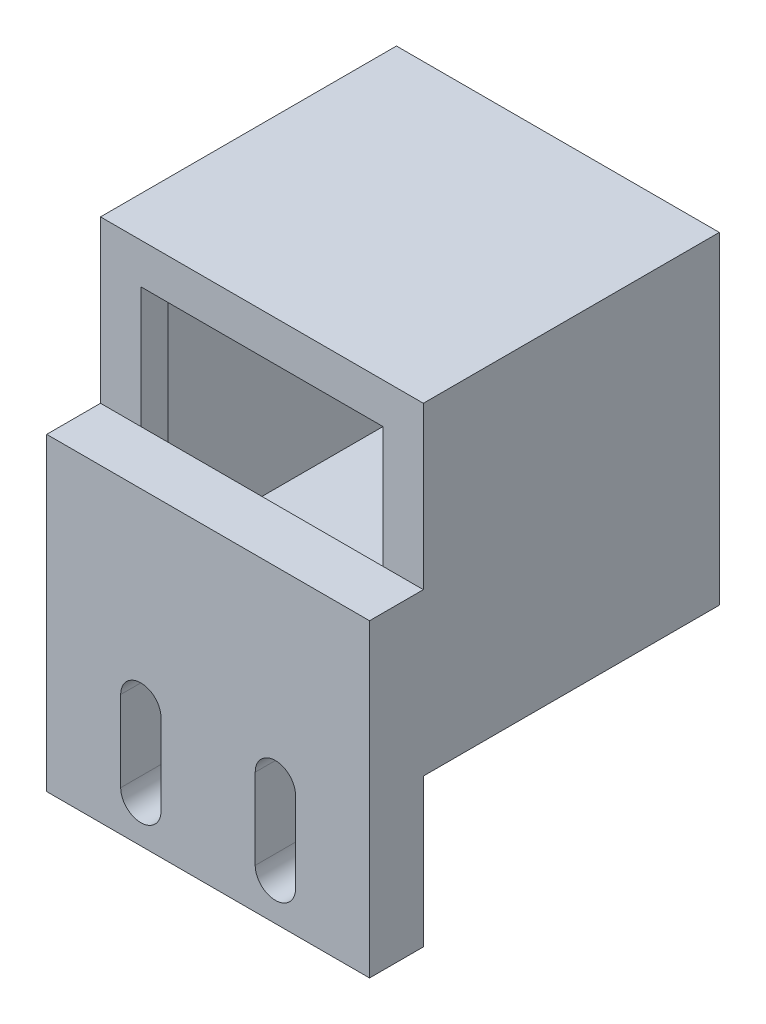
ISO-10303-21;
HEADER;
FILE_DESCRIPTION(('STEP AP214'),'2;1');
FILE_NAME('part.step','',(''),(''),'','','');
FILE_SCHEMA(('AUTOMOTIVE_DESIGN { 1 0 10303 214 1 1 1 1 }'));
ENDSEC;
DATA;
#1=APPLICATION_CONTEXT('core data for automotive mechanical design processes');
#2=APPLICATION_PROTOCOL_DEFINITION('international standard','automotive_design',2000,#1);
#3=PRODUCT_CONTEXT('',#1,'mechanical');
#4=PRODUCT('Part','Part','',(#3));
#5=PRODUCT_RELATED_PRODUCT_CATEGORY('part','',(#4));
#6=PRODUCT_DEFINITION_FORMATION('','',#4);
#7=PRODUCT_DEFINITION_CONTEXT('part definition',#1,'design');
#8=PRODUCT_DEFINITION('design','',#6,#7);
#9=PRODUCT_DEFINITION_SHAPE('','',#8);
#10=(LENGTH_UNIT() NAMED_UNIT(*) SI_UNIT(.MILLI.,.METRE.));
#11=(NAMED_UNIT(*) PLANE_ANGLE_UNIT() SI_UNIT($,.RADIAN.));
#12=(NAMED_UNIT(*) SI_UNIT($,.STERADIAN.) SOLID_ANGLE_UNIT());
#13=UNCERTAINTY_MEASURE_WITH_UNIT(LENGTH_MEASURE(1.E-05),#10,'distance_accuracy_value','');
#14=(GEOMETRIC_REPRESENTATION_CONTEXT(3) GLOBAL_UNCERTAINTY_ASSIGNED_CONTEXT((#13)) GLOBAL_UNIT_ASSIGNED_CONTEXT((#10,
#11,#12)) REPRESENTATION_CONTEXT('',''));
#15=CARTESIAN_POINT('',(0.,0.,0.));
#16=DIRECTION('',(0.,0.,1.));
#17=DIRECTION('',(1.,0.,0.));
#18=AXIS2_PLACEMENT_3D('',#15,#16,#17);
#19=CARTESIAN_POINT('',(-12.,9.,22.));
#20=DIRECTION('',(0.,1.,0.));
#21=DIRECTION('',(0.,0.,1.));
#22=AXIS2_PLACEMENT_3D('',#19,#20,#21);
#23=PLANE('',#22);
#24=DIRECTION('',(0.,0.,-1.));
#25=VECTOR('',#24,1.);
#26=CARTESIAN_POINT('',(9.,9.,22.));
#27=LINE('',#26,#25);
#28=CARTESIAN_POINT('',(9.,9.,22.));
#29=VERTEX_POINT('',#28);
#30=CARTESIAN_POINT('',(9.,9.,20.));
#31=VERTEX_POINT('',#30);
#32=EDGE_CURVE('E315',#29,#31,#27,.T.);
#33=ORIENTED_EDGE('',*,*,#32,.F.);
#34=DIRECTION('',(1.,0.,0.));
#35=VECTOR('',#34,1.);
#36=CARTESIAN_POINT('',(-12.,9.,22.));
#37=LINE('',#36,#35);
#38=CARTESIAN_POINT('',(-9.,9.,22.));
#39=VERTEX_POINT('',#38);
#40=EDGE_CURVE('E341',#39,#29,#37,.T.);
#41=ORIENTED_EDGE('',*,*,#40,.F.);
#42=DIRECTION('',(0.,0.,-1.));
#43=VECTOR('',#42,1.);
#44=CARTESIAN_POINT('',(-9.,9.,22.));
#45=LINE('',#44,#43);
#46=CARTESIAN_POINT('',(-9.,9.,20.));
#47=VERTEX_POINT('',#46);
#48=EDGE_CURVE('E334',#39,#47,#45,.T.);
#49=ORIENTED_EDGE('',*,*,#48,.T.);
#50=DIRECTION('',(1.,0.,0.));
#51=VECTOR('',#50,1.);
#52=CARTESIAN_POINT('',(-12.,9.,20.));
#53=LINE('',#52,#51);
#54=EDGE_CURVE('E338',#47,#31,#53,.T.);
#55=ORIENTED_EDGE('',*,*,#54,.T.);
#56=EDGE_LOOP('',(#33,#41,#49,#55));
#57=FACE_BOUND('',#56,.T.);
#58=ADVANCED_FACE('F36',(#57),#23,.F.);
#59=CARTESIAN_POINT('',(-9.,-9.,22.));
#60=DIRECTION('',(0.,-1.,0.));
#61=DIRECTION('',(0.,0.,-1.));
#62=AXIS2_PLACEMENT_3D('',#59,#60,#61);
#63=PLANE('',#62);
#64=DIRECTION('',(0.,0.,-1.));
#65=VECTOR('',#64,1.);
#66=CARTESIAN_POINT('',(9.00000000000001,-9.,22.));
#67=LINE('',#66,#65);
#68=CARTESIAN_POINT('',(9.00000000000001,-9.,22.));
#69=VERTEX_POINT('',#68);
#70=CARTESIAN_POINT('',(9.00000000000001,-9.,20.));
#71=VERTEX_POINT('',#70);
#72=EDGE_CURVE('E309',#69,#71,#67,.T.);
#73=ORIENTED_EDGE('',*,*,#72,.T.);
#74=DIRECTION('',(-1.,0.,0.));
#75=VECTOR('',#74,1.);
#76=CARTESIAN_POINT('',(-9.,-9.,20.));
#77=LINE('',#76,#75);
#78=CARTESIAN_POINT('',(-9.,-9.,20.));
#79=VERTEX_POINT('',#78);
#80=EDGE_CURVE('E318',#71,#79,#77,.T.);
#81=ORIENTED_EDGE('',*,*,#80,.T.);
#82=DIRECTION('',(0.,0.,-1.));
#83=VECTOR('',#82,1.);
#84=CARTESIAN_POINT('',(-9.,-9.,22.));
#85=LINE('',#84,#83);
#86=CARTESIAN_POINT('',(-9.,-9.,22.));
#87=VERTEX_POINT('',#86);
#88=EDGE_CURVE('E322',#87,#79,#85,.T.);
#89=ORIENTED_EDGE('',*,*,#88,.F.);
#90=DIRECTION('',(-1.,0.,0.));
#91=VECTOR('',#90,1.);
#92=CARTESIAN_POINT('',(-9.,-9.,22.));
#93=LINE('',#92,#91);
#94=EDGE_CURVE('E319',#69,#87,#93,.T.);
#95=ORIENTED_EDGE('',*,*,#94,.F.);
#96=EDGE_LOOP('',(#73,#81,#89,#95));
#97=FACE_BOUND('',#96,.T.);
#98=ADVANCED_FACE('F446',(#97),#63,.F.);
#99=CARTESIAN_POINT('',(-9.,-12.,22.));
#100=DIRECTION('',(-1.,0.,0.));
#101=DIRECTION('',(0.,0.,1.));
#102=AXIS2_PLACEMENT_3D('',#99,#100,#101);
#103=PLANE('',#102);
#104=ORIENTED_EDGE('',*,*,#88,.T.);
#105=DIRECTION('',(0.,1.,0.));
#106=VECTOR('',#105,1.);
#107=CARTESIAN_POINT('',(-9.,-12.,20.));
#108=LINE('',#107,#106);
#109=EDGE_CURVE('E326',#79,#47,#108,.T.);
#110=ORIENTED_EDGE('',*,*,#109,.T.);
#111=ORIENTED_EDGE('',*,*,#48,.F.);
#112=DIRECTION('',(0.,1.,0.));
#113=VECTOR('',#112,1.);
#114=CARTESIAN_POINT('',(-9.,-12.,22.));
#115=LINE('',#114,#113);
#116=CARTESIAN_POINT('',(-9.,0.,22.));
#117=VERTEX_POINT('',#116);
#118=EDGE_CURVE('E330',#117,#39,#115,.T.);
#119=ORIENTED_EDGE('',*,*,#118,.F.);
#120=EDGE_CURVE('E331',#87,#117,#115,.T.);
#121=ORIENTED_EDGE('',*,*,#120,.F.);
#122=EDGE_LOOP('',(#104,#110,#111,#119,#121));
#123=FACE_BOUND('',#122,.T.);
#124=ADVANCED_FACE('F443',(#123),#103,.F.);
#125=CARTESIAN_POINT('',(12.,12.,20.));
#126=DIRECTION('',(-1.,0.,0.));
#127=DIRECTION('',(0.,-1.,0.));
#128=AXIS2_PLACEMENT_3D('',#125,#126,#127);
#129=PLANE('',#128);
#130=DIRECTION('',(0.,1.,0.));
#131=VECTOR('',#130,1.);
#132=CARTESIAN_POINT('',(12.,12.,22.));
#133=LINE('',#132,#131);
#134=CARTESIAN_POINT('',(12.,0.,22.));
#135=VERTEX_POINT('',#134);
#136=CARTESIAN_POINT('',(12.,12.,22.));
#137=VERTEX_POINT('',#136);
#138=EDGE_CURVE('E344',#135,#137,#133,.T.);
#139=ORIENTED_EDGE('',*,*,#138,.F.);
#140=DIRECTION('',(0.,0.,-1.));
#141=VECTOR('',#140,1.);
#142=CARTESIAN_POINT('',(12.,0.,26.));
#143=LINE('',#142,#141);
#144=CARTESIAN_POINT('',(12.,0.,26.));
#145=VERTEX_POINT('',#144);
#146=EDGE_CURVE('E296',#145,#135,#143,.T.);
#147=ORIENTED_EDGE('',*,*,#146,.F.);
#148=DIRECTION('',(0.,1.,0.));
#149=VECTOR('',#148,1.);
#150=CARTESIAN_POINT('',(12.,0.,26.));
#151=LINE('',#150,#149);
#152=CARTESIAN_POINT('',(12.,-23.,26.));
#153=VERTEX_POINT('',#152);
#154=EDGE_CURVE('E282',#153,#145,#151,.T.);
#155=ORIENTED_EDGE('',*,*,#154,.F.);
#156=DIRECTION('',(0.,0.,-1.));
#157=VECTOR('',#156,1.);
#158=CARTESIAN_POINT('',(12.,-23.,26.));
#159=LINE('',#158,#157);
#160=CARTESIAN_POINT('',(12.,-23.,22.));
#161=VERTEX_POINT('',#160);
#162=EDGE_CURVE('E299',#153,#161,#159,.T.);
#163=ORIENTED_EDGE('',*,*,#162,.T.);
#164=DIRECTION('',(0.,1.,0.));
#165=VECTOR('',#164,1.);
#166=CARTESIAN_POINT('',(12.,0.,22.));
#167=LINE('',#166,#165);
#168=CARTESIAN_POINT('',(12.,-12.,22.));
#169=VERTEX_POINT('',#168);
#170=EDGE_CURVE('E290',#161,#169,#167,.T.);
#171=ORIENTED_EDGE('',*,*,#170,.T.);
#172=DIRECTION('',(0.,0.,-1.));
#173=VECTOR('',#172,1.);
#174=CARTESIAN_POINT('',(12.,-12.,20.));
#175=LINE('',#174,#173);
#176=CARTESIAN_POINT('',(12.,-12.,0.));
#177=VERTEX_POINT('',#176);
#178=EDGE_CURVE('E391',#169,#177,#175,.T.);
#179=ORIENTED_EDGE('',*,*,#178,.T.);
#180=DIRECTION('',(0.,1.,0.));
#181=VECTOR('',#180,1.);
#182=CARTESIAN_POINT('',(12.,12.,0.));
#183=LINE('',#182,#181);
#184=CARTESIAN_POINT('',(12.,12.,0.));
#185=VERTEX_POINT('',#184);
#186=EDGE_CURVE('E375',#177,#185,#183,.T.);
#187=ORIENTED_EDGE('',*,*,#186,.T.);
#188=DIRECTION('',(0.,0.,-1.));
#189=VECTOR('',#188,1.);
#190=CARTESIAN_POINT('',(12.,12.,20.));
#191=LINE('',#190,#189);
#192=EDGE_CURVE('E40',#137,#185,#191,.T.);
#193=ORIENTED_EDGE('',*,*,#192,.F.);
#194=EDGE_LOOP('',(#139,#147,#155,#163,#171,#179,#187,#193));
#195=FACE_BOUND('',#194,.T.);
#196=ADVANCED_FACE('F38',(#195),#129,.F.);
#197=CARTESIAN_POINT('',(-12.,12.,20.));
#198=DIRECTION('',(0.,-1.,0.));
#199=DIRECTION('',(0.,0.,-1.));
#200=AXIS2_PLACEMENT_3D('',#197,#198,#199);
#201=PLANE('',#200);
#202=DIRECTION('',(-1.,0.,0.));
#203=VECTOR('',#202,1.);
#204=CARTESIAN_POINT('',(-12.,12.,0.));
#205=LINE('',#204,#203);
#206=CARTESIAN_POINT('',(-12.,12.,0.));
#207=VERTEX_POINT('',#206);
#208=EDGE_CURVE('E385',#185,#207,#205,.T.);
#209=ORIENTED_EDGE('',*,*,#208,.T.);
#210=DIRECTION('',(0.,0.,-1.));
#211=VECTOR('',#210,1.);
#212=CARTESIAN_POINT('',(-12.,12.,20.));
#213=LINE('',#212,#211);
#214=CARTESIAN_POINT('',(-12.,12.,22.));
#215=VERTEX_POINT('',#214);
#216=EDGE_CURVE('E396',#215,#207,#213,.T.);
#217=ORIENTED_EDGE('',*,*,#216,.F.);
#218=DIRECTION('',(-1.,0.,0.));
#219=VECTOR('',#218,1.);
#220=CARTESIAN_POINT('',(-12.,12.,22.));
#221=LINE('',#220,#219);
#222=EDGE_CURVE('E346',#137,#215,#221,.T.);
#223=ORIENTED_EDGE('',*,*,#222,.F.);
#224=ORIENTED_EDGE('',*,*,#192,.T.);
#225=EDGE_LOOP('',(#209,#217,#223,#224));
#226=FACE_BOUND('',#225,.T.);
#227=ADVANCED_FACE('F405',(#226),#201,.F.);
#228=CARTESIAN_POINT('',(-12.,12.,20.));
#229=DIRECTION('',(1.,0.,0.));
#230=DIRECTION('',(0.,1.,0.));
#231=AXIS2_PLACEMENT_3D('',#228,#229,#230);
#232=PLANE('',#231);
#233=DIRECTION('',(0.,0.,-1.));
#234=VECTOR('',#233,1.);
#235=CARTESIAN_POINT('',(-12.,-12.,20.));
#236=LINE('',#235,#234);
#237=CARTESIAN_POINT('',(-12.,-12.,22.));
#238=VERTEX_POINT('',#237);
#239=CARTESIAN_POINT('',(-12.,-12.,0.));
#240=VERTEX_POINT('',#239);
#241=EDGE_CURVE('E394',#238,#240,#236,.T.);
#242=ORIENTED_EDGE('',*,*,#241,.F.);
#243=DIRECTION('',(0.,-1.,0.));
#244=VECTOR('',#243,1.);
#245=CARTESIAN_POINT('',(-12.,0.,22.));
#246=LINE('',#245,#244);
#247=CARTESIAN_POINT('',(-12.,-23.,22.));
#248=VERTEX_POINT('',#247);
#249=EDGE_CURVE('E244',#238,#248,#246,.T.);
#250=ORIENTED_EDGE('',*,*,#249,.T.);
#251=DIRECTION('',(0.,0.,-1.));
#252=VECTOR('',#251,1.);
#253=CARTESIAN_POINT('',(-12.,-23.,26.));
#254=LINE('',#253,#252);
#255=CARTESIAN_POINT('',(-12.,-23.,26.));
#256=VERTEX_POINT('',#255);
#257=EDGE_CURVE('E302',#256,#248,#254,.T.);
#258=ORIENTED_EDGE('',*,*,#257,.F.);
#259=DIRECTION('',(0.,-1.,0.));
#260=VECTOR('',#259,1.);
#261=CARTESIAN_POINT('',(-12.,0.,26.));
#262=LINE('',#261,#260);
#263=CARTESIAN_POINT('',(-12.,0.,26.));
#264=VERTEX_POINT('',#263);
#265=EDGE_CURVE('E277',#264,#256,#262,.T.);
#266=ORIENTED_EDGE('',*,*,#265,.F.);
#267=DIRECTION('',(0.,0.,-1.));
#268=VECTOR('',#267,1.);
#269=CARTESIAN_POINT('',(-12.,0.,26.));
#270=LINE('',#269,#268);
#271=CARTESIAN_POINT('',(-12.,0.,22.));
#272=VERTEX_POINT('',#271);
#273=EDGE_CURVE('E286',#264,#272,#270,.T.);
#274=ORIENTED_EDGE('',*,*,#273,.T.);
#275=DIRECTION('',(0.,-1.,0.));
#276=VECTOR('',#275,1.);
#277=CARTESIAN_POINT('',(-12.,12.,22.));
#278=LINE('',#277,#276);
#279=EDGE_CURVE('E339',#215,#272,#278,.T.);
#280=ORIENTED_EDGE('',*,*,#279,.F.);
#281=ORIENTED_EDGE('',*,*,#216,.T.);
#282=DIRECTION('',(0.,-1.,0.));
#283=VECTOR('',#282,1.);
#284=CARTESIAN_POINT('',(-12.,12.,0.));
#285=LINE('',#284,#283);
#286=EDGE_CURVE('E387',#207,#240,#285,.T.);
#287=ORIENTED_EDGE('',*,*,#286,.T.);
#288=EDGE_LOOP('',(#242,#250,#258,#266,#274,#280,#281,#287));
#289=FACE_BOUND('',#288,.T.);
#290=ADVANCED_FACE('F412',(#289),#232,.F.);
#291=CARTESIAN_POINT('',(-12.,-12.,20.));
#292=DIRECTION('',(0.,1.,0.));
#293=DIRECTION('',(0.,0.,1.));
#294=AXIS2_PLACEMENT_3D('',#291,#292,#293);
#295=PLANE('',#294);
#296=ORIENTED_EDGE('',*,*,#178,.F.);
#297=DIRECTION('',(1.,0.,0.));
#298=VECTOR('',#297,1.);
#299=CARTESIAN_POINT('',(-12.,-12.,22.));
#300=LINE('',#299,#298);
#301=EDGE_CURVE('E327',#238,#169,#300,.T.);
#302=ORIENTED_EDGE('',*,*,#301,.F.);
#303=ORIENTED_EDGE('',*,*,#241,.T.);
#304=DIRECTION('',(1.,0.,0.));
#305=VECTOR('',#304,1.);
#306=CARTESIAN_POINT('',(-12.,-12.,0.));
#307=LINE('',#306,#305);
#308=EDGE_CURVE('E389',#240,#177,#307,.T.);
#309=ORIENTED_EDGE('',*,*,#308,.T.);
#310=EDGE_LOOP('',(#296,#302,#303,#309));
#311=FACE_BOUND('',#310,.T.);
#312=ADVANCED_FACE('F415',(#311),#295,.F.);
#313=CARTESIAN_POINT('',(0.,0.,0.));
#314=DIRECTION('',(0.,0.,1.));
#315=DIRECTION('',(1.,0.,0.));
#316=AXIS2_PLACEMENT_3D('',#313,#314,#315);
#317=PLANE('',#316);
#318=DIRECTION('',(1.,0.,0.));
#319=VECTOR('',#318,1.);
#320=CARTESIAN_POINT('',(-10.5,-10.5,0.));
#321=LINE('',#320,#319);
#322=CARTESIAN_POINT('',(-10.5,-10.5,0.));
#323=VERTEX_POINT('',#322);
#324=CARTESIAN_POINT('',(10.5,-10.5,0.));
#325=VERTEX_POINT('',#324);
#326=EDGE_CURVE('E361',#323,#325,#321,.T.);
#327=ORIENTED_EDGE('',*,*,#326,.T.);
#328=DIRECTION('',(0.,1.,0.));
#329=VECTOR('',#328,1.);
#330=CARTESIAN_POINT('',(10.5,10.5,0.));
#331=LINE('',#330,#329);
#332=CARTESIAN_POINT('',(10.5,10.5,0.));
#333=VERTEX_POINT('',#332);
#334=EDGE_CURVE('E351',#325,#333,#331,.T.);
#335=ORIENTED_EDGE('',*,*,#334,.T.);
#336=DIRECTION('',(-1.,0.,0.));
#337=VECTOR('',#336,1.);
#338=CARTESIAN_POINT('',(-10.5,10.5,0.));
#339=LINE('',#338,#337);
#340=CARTESIAN_POINT('',(-10.5,10.5,0.));
#341=VERTEX_POINT('',#340);
#342=EDGE_CURVE('E354',#333,#341,#339,.T.);
#343=ORIENTED_EDGE('',*,*,#342,.T.);
#344=DIRECTION('',(0.,-1.,0.));
#345=VECTOR('',#344,1.);
#346=CARTESIAN_POINT('',(-10.5,10.5,0.));
#347=LINE('',#346,#345);
#348=EDGE_CURVE('E358',#341,#323,#347,.T.);
#349=ORIENTED_EDGE('',*,*,#348,.T.);
#350=EDGE_LOOP('',(#327,#335,#343,#349));
#351=FACE_BOUND('',#350,.T.);
#352=ORIENTED_EDGE('',*,*,#186,.F.);
#353=ORIENTED_EDGE('',*,*,#308,.F.);
#354=ORIENTED_EDGE('',*,*,#286,.F.);
#355=ORIENTED_EDGE('',*,*,#208,.F.);
#356=EDGE_LOOP('',(#352,#353,#354,#355));
#357=FACE_BOUND('',#356,.T.);
#358=ADVANCED_FACE('F411',(#351,#357),#317,.F.);
#359=CARTESIAN_POINT('',(10.5,10.5,0.));
#360=DIRECTION('',(1.,0.,0.));
#361=DIRECTION('',(0.,1.,0.));
#362=AXIS2_PLACEMENT_3D('',#359,#360,#361);
#363=PLANE('',#362);
#364=DIRECTION('',(0.,1.,0.));
#365=VECTOR('',#364,1.);
#366=CARTESIAN_POINT('',(10.5,10.5,20.));
#367=LINE('',#366,#365);
#368=CARTESIAN_POINT('',(10.5,-10.5,20.));
#369=VERTEX_POINT('',#368);
#370=CARTESIAN_POINT('',(10.5,10.5,20.));
#371=VERTEX_POINT('',#370);
#372=EDGE_CURVE('E349',#369,#371,#367,.T.);
#373=ORIENTED_EDGE('',*,*,#372,.T.);
#374=DIRECTION('',(0.,0.,1.));
#375=VECTOR('',#374,1.);
#376=CARTESIAN_POINT('',(10.5,10.5,0.));
#377=LINE('',#376,#375);
#378=EDGE_CURVE('E364',#333,#371,#377,.T.);
#379=ORIENTED_EDGE('',*,*,#378,.F.);
#380=ORIENTED_EDGE('',*,*,#334,.F.);
#381=DIRECTION('',(0.,0.,1.));
#382=VECTOR('',#381,1.);
#383=CARTESIAN_POINT('',(10.5,-10.5,0.));
#384=LINE('',#383,#382);
#385=EDGE_CURVE('E372',#325,#369,#384,.T.);
#386=ORIENTED_EDGE('',*,*,#385,.T.);
#387=EDGE_LOOP('',(#373,#379,#380,#386));
#388=FACE_BOUND('',#387,.T.);
#389=ADVANCED_FACE('F480',(#388),#363,.F.);
#390=CARTESIAN_POINT('',(-10.5,-10.5,0.));
#391=DIRECTION('',(0.,-1.,0.));
#392=DIRECTION('',(0.,0.,-1.));
#393=AXIS2_PLACEMENT_3D('',#390,#391,#392);
#394=PLANE('',#393);
#395=DIRECTION('',(1.,0.,0.));
#396=VECTOR('',#395,1.);
#397=CARTESIAN_POINT('',(-10.5,-10.5,20.));
#398=LINE('',#397,#396);
#399=CARTESIAN_POINT('',(-10.5,-10.5,20.));
#400=VERTEX_POINT('',#399);
#401=EDGE_CURVE('E355',#400,#369,#398,.T.);
#402=ORIENTED_EDGE('',*,*,#401,.T.);
#403=ORIENTED_EDGE('',*,*,#385,.F.);
#404=ORIENTED_EDGE('',*,*,#326,.F.);
#405=DIRECTION('',(0.,0.,1.));
#406=VECTOR('',#405,1.);
#407=CARTESIAN_POINT('',(-10.5,-10.5,0.));
#408=LINE('',#407,#406);
#409=EDGE_CURVE('E376',#323,#400,#408,.T.);
#410=ORIENTED_EDGE('',*,*,#409,.T.);
#411=EDGE_LOOP('',(#402,#403,#404,#410));
#412=FACE_BOUND('',#411,.T.);
#413=ADVANCED_FACE('F476',(#412),#394,.F.);
#414=CARTESIAN_POINT('',(-10.5,10.5,0.));
#415=DIRECTION('',(-1.,0.,0.));
#416=DIRECTION('',(0.,-1.,0.));
#417=AXIS2_PLACEMENT_3D('',#414,#415,#416);
#418=PLANE('',#417);
#419=DIRECTION('',(0.,-1.,0.));
#420=VECTOR('',#419,1.);
#421=CARTESIAN_POINT('',(-10.5,10.5,20.));
#422=LINE('',#421,#420);
#423=CARTESIAN_POINT('',(-10.5,10.5,20.));
#424=VERTEX_POINT('',#423);
#425=EDGE_CURVE('E369',#424,#400,#422,.T.);
#426=ORIENTED_EDGE('',*,*,#425,.T.);
#427=ORIENTED_EDGE('',*,*,#409,.F.);
#428=ORIENTED_EDGE('',*,*,#348,.F.);
#429=DIRECTION('',(0.,0.,1.));
#430=VECTOR('',#429,1.);
#431=CARTESIAN_POINT('',(-10.5,10.5,0.));
#432=LINE('',#431,#430);
#433=EDGE_CURVE('E379',#341,#424,#432,.T.);
#434=ORIENTED_EDGE('',*,*,#433,.T.);
#435=EDGE_LOOP('',(#426,#427,#428,#434));
#436=FACE_BOUND('',#435,.T.);
#437=ADVANCED_FACE('F479',(#436),#418,.F.);
#438=CARTESIAN_POINT('',(-10.5,10.5,0.));
#439=DIRECTION('',(0.,1.,0.));
#440=DIRECTION('',(0.,0.,1.));
#441=AXIS2_PLACEMENT_3D('',#438,#439,#440);
#442=PLANE('',#441);
#443=DIRECTION('',(-1.,0.,0.));
#444=VECTOR('',#443,1.);
#445=CARTESIAN_POINT('',(-10.5,10.5,20.));
#446=LINE('',#445,#444);
#447=EDGE_CURVE('E366',#371,#424,#446,.T.);
#448=ORIENTED_EDGE('',*,*,#447,.T.);
#449=ORIENTED_EDGE('',*,*,#433,.F.);
#450=ORIENTED_EDGE('',*,*,#342,.F.);
#451=ORIENTED_EDGE('',*,*,#378,.T.);
#452=EDGE_LOOP('',(#448,#449,#450,#451));
#453=FACE_BOUND('',#452,.T.);
#454=ADVANCED_FACE('F484',(#453),#442,.F.);
#455=CARTESIAN_POINT('',(0.,0.,22.));
#456=DIRECTION('',(0.,0.,1.));
#457=DIRECTION('',(1.,0.,0.));
#458=AXIS2_PLACEMENT_3D('',#455,#456,#457);
#459=PLANE('',#458);
#460=DIRECTION('',(-1.,0.,0.));
#461=VECTOR('',#460,1.);
#462=CARTESIAN_POINT('',(-12.,0.,22.));
#463=LINE('',#462,#461);
#464=CARTESIAN_POINT('',(9.00000000000001,0.,22.));
#465=VERTEX_POINT('',#464);
#466=EDGE_CURVE('E46',#135,#465,#463,.T.);
#467=ORIENTED_EDGE('',*,*,#466,.F.);
#468=ORIENTED_EDGE('',*,*,#138,.T.);
#469=ORIENTED_EDGE('',*,*,#222,.T.);
#470=ORIENTED_EDGE('',*,*,#279,.T.);
#471=EDGE_CURVE('E11',#117,#272,#463,.T.);
#472=ORIENTED_EDGE('',*,*,#471,.F.);
#473=ORIENTED_EDGE('',*,*,#118,.T.);
#474=ORIENTED_EDGE('',*,*,#40,.T.);
#475=DIRECTION('',(0.,-1.,0.));
#476=VECTOR('',#475,1.);
#477=CARTESIAN_POINT('',(9.,9.,22.));
#478=LINE('',#477,#476);
#479=EDGE_CURVE('E306',#29,#465,#478,.T.);
#480=ORIENTED_EDGE('',*,*,#479,.T.);
#481=EDGE_LOOP('',(#467,#468,#469,#470,#472,#473,#474,#480));
#482=FACE_BOUND('',#481,.T.);
#483=ADVANCED_FACE('F435',(#482),#459,.T.);
#484=CARTESIAN_POINT('',(0.,0.,20.));
#485=DIRECTION('',(0.,0.,1.));
#486=DIRECTION('',(1.,0.,0.));
#487=AXIS2_PLACEMENT_3D('',#484,#485,#486);
#488=PLANE('',#487);
#489=DIRECTION('',(0.,-1.,0.));
#490=VECTOR('',#489,1.);
#491=CARTESIAN_POINT('',(9.,9.,20.));
#492=LINE('',#491,#490);
#493=EDGE_CURVE('E305',#31,#71,#492,.T.);
#494=ORIENTED_EDGE('',*,*,#493,.F.);
#495=ORIENTED_EDGE('',*,*,#54,.F.);
#496=ORIENTED_EDGE('',*,*,#109,.F.);
#497=ORIENTED_EDGE('',*,*,#80,.F.);
#498=EDGE_LOOP('',(#494,#495,#496,#497));
#499=FACE_BOUND('',#498,.T.);
#500=ORIENTED_EDGE('',*,*,#447,.F.);
#501=ORIENTED_EDGE('',*,*,#372,.F.);
#502=ORIENTED_EDGE('',*,*,#401,.F.);
#503=ORIENTED_EDGE('',*,*,#425,.F.);
#504=EDGE_LOOP('',(#500,#501,#502,#503));
#505=FACE_BOUND('',#504,.T.);
#506=ADVANCED_FACE('F452',(#499,#505),#488,.F.);
#507=CARTESIAN_POINT('',(9.,9.,22.));
#508=DIRECTION('',(1.,0.,0.));
#509=DIRECTION('',(0.,1.,0.));
#510=AXIS2_PLACEMENT_3D('',#507,#508,#509);
#511=PLANE('',#510);
#512=ORIENTED_EDGE('',*,*,#493,.T.);
#513=ORIENTED_EDGE('',*,*,#72,.F.);
#514=EDGE_CURVE('E310',#465,#69,#478,.T.);
#515=ORIENTED_EDGE('',*,*,#514,.F.);
#516=ORIENTED_EDGE('',*,*,#479,.F.);
#517=ORIENTED_EDGE('',*,*,#32,.T.);
#518=EDGE_LOOP('',(#512,#513,#515,#516,#517));
#519=FACE_BOUND('',#518,.T.);
#520=ADVANCED_FACE('F458',(#519),#511,.F.);
#521=CARTESIAN_POINT('',(0.,0.,22.));
#522=DIRECTION('',(0.,0.,1.));
#523=DIRECTION('',(1.,0.,0.));
#524=AXIS2_PLACEMENT_3D('',#521,#522,#523);
#525=PLANE('',#524);
#526=EDGE_CURVE('E47',#465,#117,#463,.T.);
#527=ORIENTED_EDGE('',*,*,#526,.F.);
#528=ORIENTED_EDGE('',*,*,#514,.T.);
#529=ORIENTED_EDGE('',*,*,#94,.T.);
#530=ORIENTED_EDGE('',*,*,#120,.T.);
#531=EDGE_LOOP('',(#527,#528,#529,#530));
#532=FACE_BOUND('',#531,.T.);
#533=ADVANCED_FACE('F440',(#532),#525,.F.);
#534=DIRECTION('',(0.,1.,0.));
#535=VECTOR('',#534,1.);
#536=CARTESIAN_POINT('',(-3.5,-14.,22.));
#537=LINE('',#536,#535);
#538=CARTESIAN_POINT('',(-3.5,-20.,22.));
#539=VERTEX_POINT('',#538);
#540=CARTESIAN_POINT('',(-3.5,-14.,22.));
#541=VERTEX_POINT('',#540);
#542=EDGE_CURVE('E218',#539,#541,#537,.T.);
#543=ORIENTED_EDGE('',*,*,#542,.T.);
#544=CARTESIAN_POINT('',(-5.,-14.,22.));
#545=DIRECTION('',(0.,0.,1.));
#546=DIRECTION('',(1.,0.,0.));
#547=AXIS2_PLACEMENT_3D('',#544,#545,#546);
#548=CIRCLE('',#547,1.5);
#549=CARTESIAN_POINT('',(-6.5,-14.,22.));
#550=VERTEX_POINT('',#549);
#551=EDGE_CURVE('E210',#541,#550,#548,.T.);
#552=ORIENTED_EDGE('',*,*,#551,.T.);
#553=DIRECTION('',(0.,-1.,0.));
#554=VECTOR('',#553,1.);
#555=CARTESIAN_POINT('',(-6.5,-14.,22.));
#556=LINE('',#555,#554);
#557=CARTESIAN_POINT('',(-6.5,-20.,22.));
#558=VERTEX_POINT('',#557);
#559=EDGE_CURVE('E221',#550,#558,#556,.T.);
#560=ORIENTED_EDGE('',*,*,#559,.T.);
#561=CARTESIAN_POINT('',(-5.,-20.,22.));
#562=DIRECTION('',(0.,0.,1.));
#563=DIRECTION('',(1.,0.,0.));
#564=AXIS2_PLACEMENT_3D('',#561,#562,#563);
#565=CIRCLE('',#564,1.5);
#566=EDGE_CURVE('E54',#558,#539,#565,.T.);
#567=ORIENTED_EDGE('',*,*,#566,.T.);
#568=EDGE_LOOP('',(#543,#552,#560,#567));
#569=FACE_BOUND('',#568,.T.);
#570=DIRECTION('',(0.,1.,0.));
#571=VECTOR('',#570,1.);
#572=CARTESIAN_POINT('',(6.5,-14.,22.));
#573=LINE('',#572,#571);
#574=CARTESIAN_POINT('',(6.5,-20.,22.));
#575=VERTEX_POINT('',#574);
#576=CARTESIAN_POINT('',(6.5,-14.,22.));
#577=VERTEX_POINT('',#576);
#578=EDGE_CURVE('E256',#575,#577,#573,.T.);
#579=ORIENTED_EDGE('',*,*,#578,.T.);
#580=CARTESIAN_POINT('',(5.,-14.,22.));
#581=DIRECTION('',(0.,0.,1.));
#582=DIRECTION('',(-1.,0.,0.));
#583=AXIS2_PLACEMENT_3D('',#580,#581,#582);
#584=CIRCLE('',#583,1.5);
#585=CARTESIAN_POINT('',(3.5,-14.,22.));
#586=VERTEX_POINT('',#585);
#587=EDGE_CURVE('E248',#577,#586,#584,.T.);
#588=ORIENTED_EDGE('',*,*,#587,.T.);
#589=DIRECTION('',(0.,-1.,0.));
#590=VECTOR('',#589,1.);
#591=CARTESIAN_POINT('',(3.5,-14.,22.));
#592=LINE('',#591,#590);
#593=CARTESIAN_POINT('',(3.5,-20.,22.));
#594=VERTEX_POINT('',#593);
#595=EDGE_CURVE('E251',#586,#594,#592,.T.);
#596=ORIENTED_EDGE('',*,*,#595,.T.);
#597=CARTESIAN_POINT('',(5.,-20.,22.));
#598=DIRECTION('',(0.,0.,1.));
#599=DIRECTION('',(-1.,0.,0.));
#600=AXIS2_PLACEMENT_3D('',#597,#598,#599);
#601=CIRCLE('',#600,1.5);
#602=EDGE_CURVE('E62',#594,#575,#601,.T.);
#603=ORIENTED_EDGE('',*,*,#602,.T.);
#604=EDGE_LOOP('',(#579,#588,#596,#603));
#605=FACE_BOUND('',#604,.T.);
#606=ORIENTED_EDGE('',*,*,#249,.F.);
#607=ORIENTED_EDGE('',*,*,#301,.T.);
#608=ORIENTED_EDGE('',*,*,#170,.F.);
#609=DIRECTION('',(1.,0.,0.));
#610=VECTOR('',#609,1.);
#611=CARTESIAN_POINT('',(-12.,-23.,22.));
#612=LINE('',#611,#610);
#613=EDGE_CURVE('E288',#248,#161,#612,.T.);
#614=ORIENTED_EDGE('',*,*,#613,.F.);
#615=EDGE_LOOP('',(#606,#607,#608,#614));
#616=FACE_BOUND('',#615,.T.);
#617=ADVANCED_FACE('F225',(#569,#605,#616),#525,.F.);
#618=CARTESIAN_POINT('',(-12.,-23.,26.));
#619=DIRECTION('',(0.,1.,0.));
#620=DIRECTION('',(0.,0.,1.));
#621=AXIS2_PLACEMENT_3D('',#618,#619,#620);
#622=PLANE('',#621);
#623=ORIENTED_EDGE('',*,*,#613,.T.);
#624=ORIENTED_EDGE('',*,*,#162,.F.);
#625=DIRECTION('',(1.,0.,0.));
#626=VECTOR('',#625,1.);
#627=CARTESIAN_POINT('',(-12.,-23.,26.));
#628=LINE('',#627,#626);
#629=EDGE_CURVE('E280',#256,#153,#628,.T.);
#630=ORIENTED_EDGE('',*,*,#629,.F.);
#631=ORIENTED_EDGE('',*,*,#257,.T.);
#632=EDGE_LOOP('',(#623,#624,#630,#631));
#633=FACE_BOUND('',#632,.T.);
#634=ADVANCED_FACE('F423',(#633),#622,.F.);
#635=CARTESIAN_POINT('',(-12.,0.,26.));
#636=DIRECTION('',(0.,-1.,0.));
#637=DIRECTION('',(0.,0.,-1.));
#638=AXIS2_PLACEMENT_3D('',#635,#636,#637);
#639=PLANE('',#638);
#640=ORIENTED_EDGE('',*,*,#466,.T.);
#641=ORIENTED_EDGE('',*,*,#526,.T.);
#642=ORIENTED_EDGE('',*,*,#471,.T.);
#643=ORIENTED_EDGE('',*,*,#273,.F.);
#644=DIRECTION('',(-1.,0.,0.));
#645=VECTOR('',#644,1.);
#646=CARTESIAN_POINT('',(-12.,0.,26.));
#647=LINE('',#646,#645);
#648=EDGE_CURVE('E284',#145,#264,#647,.T.);
#649=ORIENTED_EDGE('',*,*,#648,.F.);
#650=ORIENTED_EDGE('',*,*,#146,.T.);
#651=EDGE_LOOP('',(#640,#641,#642,#643,#649,#650));
#652=FACE_BOUND('',#651,.T.);
#653=ADVANCED_FACE('F432',(#652),#639,.F.);
#654=CARTESIAN_POINT('',(0.,0.,26.));
#655=DIRECTION('',(0.,0.,1.));
#656=DIRECTION('',(1.,0.,0.));
#657=AXIS2_PLACEMENT_3D('',#654,#655,#656);
#658=PLANE('',#657);
#659=CARTESIAN_POINT('',(-5.,-14.,26.));
#660=DIRECTION('',(0.,0.,1.));
#661=DIRECTION('',(1.,0.,0.));
#662=AXIS2_PLACEMENT_3D('',#659,#660,#661);
#663=CIRCLE('',#662,1.5);
#664=CARTESIAN_POINT('',(-3.5,-14.,26.));
#665=VERTEX_POINT('',#664);
#666=CARTESIAN_POINT('',(-6.5,-14.,26.));
#667=VERTEX_POINT('',#666);
#668=EDGE_CURVE('E213',#665,#667,#663,.T.);
#669=ORIENTED_EDGE('',*,*,#668,.F.);
#670=DIRECTION('',(0.,1.,0.));
#671=VECTOR('',#670,1.);
#672=CARTESIAN_POINT('',(-3.5,-14.,26.));
#673=LINE('',#672,#671);
#674=CARTESIAN_POINT('',(-3.5,-20.,26.));
#675=VERTEX_POINT('',#674);
#676=EDGE_CURVE('E228',#675,#665,#673,.T.);
#677=ORIENTED_EDGE('',*,*,#676,.F.);
#678=CARTESIAN_POINT('',(-5.,-20.,26.));
#679=DIRECTION('',(0.,0.,1.));
#680=DIRECTION('',(1.,0.,0.));
#681=AXIS2_PLACEMENT_3D('',#678,#679,#680);
#682=CIRCLE('',#681,1.5);
#683=CARTESIAN_POINT('',(-6.5,-20.,26.));
#684=VERTEX_POINT('',#683);
#685=EDGE_CURVE('E231',#684,#675,#682,.T.);
#686=ORIENTED_EDGE('',*,*,#685,.F.);
#687=DIRECTION('',(0.,-1.,0.));
#688=VECTOR('',#687,1.);
#689=CARTESIAN_POINT('',(-6.5,-14.,26.));
#690=LINE('',#689,#688);
#691=EDGE_CURVE('E237',#667,#684,#690,.T.);
#692=ORIENTED_EDGE('',*,*,#691,.F.);
#693=EDGE_LOOP('',(#669,#677,#686,#692));
#694=FACE_BOUND('',#693,.T.);
#695=CARTESIAN_POINT('',(5.,-14.,26.));
#696=DIRECTION('',(0.,0.,1.));
#697=DIRECTION('',(-1.,0.,0.));
#698=AXIS2_PLACEMENT_3D('',#695,#696,#697);
#699=CIRCLE('',#698,1.5);
#700=CARTESIAN_POINT('',(6.5,-14.,26.));
#701=VERTEX_POINT('',#700);
#702=CARTESIAN_POINT('',(3.5,-14.,26.));
#703=VERTEX_POINT('',#702);
#704=EDGE_CURVE('E260',#701,#703,#699,.T.);
#705=ORIENTED_EDGE('',*,*,#704,.F.);
#706=DIRECTION('',(0.,1.,0.));
#707=VECTOR('',#706,1.);
#708=CARTESIAN_POINT('',(6.5,-14.,26.));
#709=LINE('',#708,#707);
#710=CARTESIAN_POINT('',(6.5,-20.,26.));
#711=VERTEX_POINT('',#710);
#712=EDGE_CURVE('E252',#711,#701,#709,.T.);
#713=ORIENTED_EDGE('',*,*,#712,.F.);
#714=CARTESIAN_POINT('',(5.,-20.,26.));
#715=DIRECTION('',(0.,0.,1.));
#716=DIRECTION('',(-1.,0.,0.));
#717=AXIS2_PLACEMENT_3D('',#714,#715,#716);
#718=CIRCLE('',#717,1.5);
#719=CARTESIAN_POINT('',(3.5,-20.,26.));
#720=VERTEX_POINT('',#719);
#721=EDGE_CURVE('E265',#720,#711,#718,.T.);
#722=ORIENTED_EDGE('',*,*,#721,.F.);
#723=DIRECTION('',(0.,-1.,0.));
#724=VECTOR('',#723,1.);
#725=CARTESIAN_POINT('',(3.5,-14.,26.));
#726=LINE('',#725,#724);
#727=EDGE_CURVE('E262',#703,#720,#726,.T.);
#728=ORIENTED_EDGE('',*,*,#727,.F.);
#729=EDGE_LOOP('',(#705,#713,#722,#728));
#730=FACE_BOUND('',#729,.T.);
#731=ORIENTED_EDGE('',*,*,#265,.T.);
#732=ORIENTED_EDGE('',*,*,#629,.T.);
#733=ORIENTED_EDGE('',*,*,#154,.T.);
#734=ORIENTED_EDGE('',*,*,#648,.T.);
#735=EDGE_LOOP('',(#731,#732,#733,#734));
#736=FACE_BOUND('',#735,.T.);
#737=ADVANCED_FACE('F427',(#694,#730,#736),#658,.T.);
#738=CARTESIAN_POINT('',(5.,-14.,22.));
#739=DIRECTION('',(0.,0.,1.));
#740=DIRECTION('',(1.,0.,0.));
#741=AXIS2_PLACEMENT_3D('',#738,#739,#740);
#742=CYLINDRICAL_SURFACE('',#741,1.5);
#743=ORIENTED_EDGE('',*,*,#704,.T.);
#744=DIRECTION('',(0.,0.,1.));
#745=VECTOR('',#744,1.);
#746=CARTESIAN_POINT('',(3.5,-14.,22.));
#747=LINE('',#746,#745);
#748=EDGE_CURVE('E259',#586,#703,#747,.T.);
#749=ORIENTED_EDGE('',*,*,#748,.F.);
#750=ORIENTED_EDGE('',*,*,#587,.F.);
#751=DIRECTION('',(0.,0.,1.));
#752=VECTOR('',#751,1.);
#753=CARTESIAN_POINT('',(6.5,-14.,22.));
#754=LINE('',#753,#752);
#755=EDGE_CURVE('E238',#577,#701,#754,.T.);
#756=ORIENTED_EDGE('',*,*,#755,.T.);
#757=EDGE_LOOP('',(#743,#749,#750,#756));
#758=FACE_BOUND('',#757,.T.);
#759=ADVANCED_FACE('F664',(#758),#742,.F.);
#760=CARTESIAN_POINT('',(6.5,-14.,22.));
#761=DIRECTION('',(1.,0.,0.));
#762=DIRECTION('',(0.,1.,0.));
#763=AXIS2_PLACEMENT_3D('',#760,#761,#762);
#764=PLANE('',#763);
#765=ORIENTED_EDGE('',*,*,#712,.T.);
#766=ORIENTED_EDGE('',*,*,#755,.F.);
#767=ORIENTED_EDGE('',*,*,#578,.F.);
#768=DIRECTION('',(0.,0.,1.));
#769=VECTOR('',#768,1.);
#770=CARTESIAN_POINT('',(6.5,-20.,22.));
#771=LINE('',#770,#769);
#772=EDGE_CURVE('E271',#575,#711,#771,.T.);
#773=ORIENTED_EDGE('',*,*,#772,.T.);
#774=EDGE_LOOP('',(#765,#766,#767,#773));
#775=FACE_BOUND('',#774,.T.);
#776=ADVANCED_FACE('F673',(#775),#764,.F.);
#777=CARTESIAN_POINT('',(5.,-20.,22.));
#778=DIRECTION('',(0.,0.,1.));
#779=DIRECTION('',(1.,0.,0.));
#780=AXIS2_PLACEMENT_3D('',#777,#778,#779);
#781=CYLINDRICAL_SURFACE('',#780,1.5);
#782=ORIENTED_EDGE('',*,*,#721,.T.);
#783=ORIENTED_EDGE('',*,*,#772,.F.);
#784=ORIENTED_EDGE('',*,*,#602,.F.);
#785=DIRECTION('',(0.,0.,1.));
#786=VECTOR('',#785,1.);
#787=CARTESIAN_POINT('',(3.5,-20.,22.));
#788=LINE('',#787,#786);
#789=EDGE_CURVE('E273',#594,#720,#788,.T.);
#790=ORIENTED_EDGE('',*,*,#789,.T.);
#791=EDGE_LOOP('',(#782,#783,#784,#790));
#792=FACE_BOUND('',#791,.T.);
#793=ADVANCED_FACE('F682',(#792),#781,.F.);
#794=CARTESIAN_POINT('',(3.5,-14.,22.));
#795=DIRECTION('',(-1.,0.,0.));
#796=DIRECTION('',(0.,-1.,0.));
#797=AXIS2_PLACEMENT_3D('',#794,#795,#796);
#798=PLANE('',#797);
#799=ORIENTED_EDGE('',*,*,#727,.T.);
#800=ORIENTED_EDGE('',*,*,#789,.F.);
#801=ORIENTED_EDGE('',*,*,#595,.F.);
#802=ORIENTED_EDGE('',*,*,#748,.T.);
#803=EDGE_LOOP('',(#799,#800,#801,#802));
#804=FACE_BOUND('',#803,.T.);
#805=ADVANCED_FACE('F691',(#804),#798,.F.);
#806=CARTESIAN_POINT('',(-5.,-14.,22.));
#807=DIRECTION('',(0.,0.,1.));
#808=DIRECTION('',(1.,0.,0.));
#809=AXIS2_PLACEMENT_3D('',#806,#807,#808);
#810=CYLINDRICAL_SURFACE('',#809,1.5);
#811=ORIENTED_EDGE('',*,*,#668,.T.);
#812=DIRECTION('',(0.,0.,1.));
#813=VECTOR('',#812,1.);
#814=CARTESIAN_POINT('',(-6.5,-14.,22.));
#815=LINE('',#814,#813);
#816=EDGE_CURVE('E206',#550,#667,#815,.T.);
#817=ORIENTED_EDGE('',*,*,#816,.F.);
#818=ORIENTED_EDGE('',*,*,#551,.F.);
#819=DIRECTION('',(0.,0.,1.));
#820=VECTOR('',#819,1.);
#821=CARTESIAN_POINT('',(-3.5,-14.,22.));
#822=LINE('',#821,#820);
#823=EDGE_CURVE('E242',#541,#665,#822,.T.);
#824=ORIENTED_EDGE('',*,*,#823,.T.);
#825=EDGE_LOOP('',(#811,#817,#818,#824));
#826=FACE_BOUND('',#825,.T.);
#827=ADVANCED_FACE('F208',(#826),#810,.F.);
#828=CARTESIAN_POINT('',(-3.5,-14.,22.));
#829=DIRECTION('',(1.,0.,0.));
#830=DIRECTION('',(0.,1.,0.));
#831=AXIS2_PLACEMENT_3D('',#828,#829,#830);
#832=PLANE('',#831);
#833=ORIENTED_EDGE('',*,*,#676,.T.);
#834=ORIENTED_EDGE('',*,*,#823,.F.);
#835=ORIENTED_EDGE('',*,*,#542,.F.);
#836=DIRECTION('',(0.,0.,1.));
#837=VECTOR('',#836,1.);
#838=CARTESIAN_POINT('',(-3.5,-20.,22.));
#839=LINE('',#838,#837);
#840=EDGE_CURVE('E245',#539,#675,#839,.T.);
#841=ORIENTED_EDGE('',*,*,#840,.T.);
#842=EDGE_LOOP('',(#833,#834,#835,#841));
#843=FACE_BOUND('',#842,.T.);
#844=ADVANCED_FACE('F707',(#843),#832,.F.);
#845=CARTESIAN_POINT('',(-5.,-20.,22.));
#846=DIRECTION('',(0.,0.,1.));
#847=DIRECTION('',(1.,0.,0.));
#848=AXIS2_PLACEMENT_3D('',#845,#846,#847);
#849=CYLINDRICAL_SURFACE('',#848,1.5);
#850=ORIENTED_EDGE('',*,*,#685,.T.);
#851=ORIENTED_EDGE('',*,*,#840,.F.);
#852=ORIENTED_EDGE('',*,*,#566,.F.);
#853=DIRECTION('',(0.,0.,1.));
#854=VECTOR('',#853,1.);
#855=CARTESIAN_POINT('',(-6.5,-20.,22.));
#856=LINE('',#855,#854);
#857=EDGE_CURVE('E217',#558,#684,#856,.T.);
#858=ORIENTED_EDGE('',*,*,#857,.T.);
#859=EDGE_LOOP('',(#850,#851,#852,#858));
#860=FACE_BOUND('',#859,.T.);
#861=ADVANCED_FACE('F715',(#860),#849,.F.);
#862=CARTESIAN_POINT('',(-6.5,-14.,22.));
#863=DIRECTION('',(-1.,0.,0.));
#864=DIRECTION('',(0.,-1.,0.));
#865=AXIS2_PLACEMENT_3D('',#862,#863,#864);
#866=PLANE('',#865);
#867=ORIENTED_EDGE('',*,*,#691,.T.);
#868=ORIENTED_EDGE('',*,*,#857,.F.);
#869=ORIENTED_EDGE('',*,*,#559,.F.);
#870=ORIENTED_EDGE('',*,*,#816,.T.);
#871=EDGE_LOOP('',(#867,#868,#869,#870));
#872=FACE_BOUND('',#871,.T.);
#873=ADVANCED_FACE('F222',(#872),#866,.F.);
#874=CLOSED_SHELL('',(#58,#98,#124,#196,#227,#290,#312,#358,#389,#413,#437,#454,#483,#506,#520,
#533,#617,#634,#653,#737,#759,#776,#793,#805,#827,#844,#861,#873));
#875=MANIFOLD_SOLID_BREP('B2',#874);
#876=ADVANCED_BREP_SHAPE_REPRESENTATION('',(#18,#875),#14);
#877=SHAPE_DEFINITION_REPRESENTATION(#9,#876);
ENDSEC;
END-ISO-10303-21;
